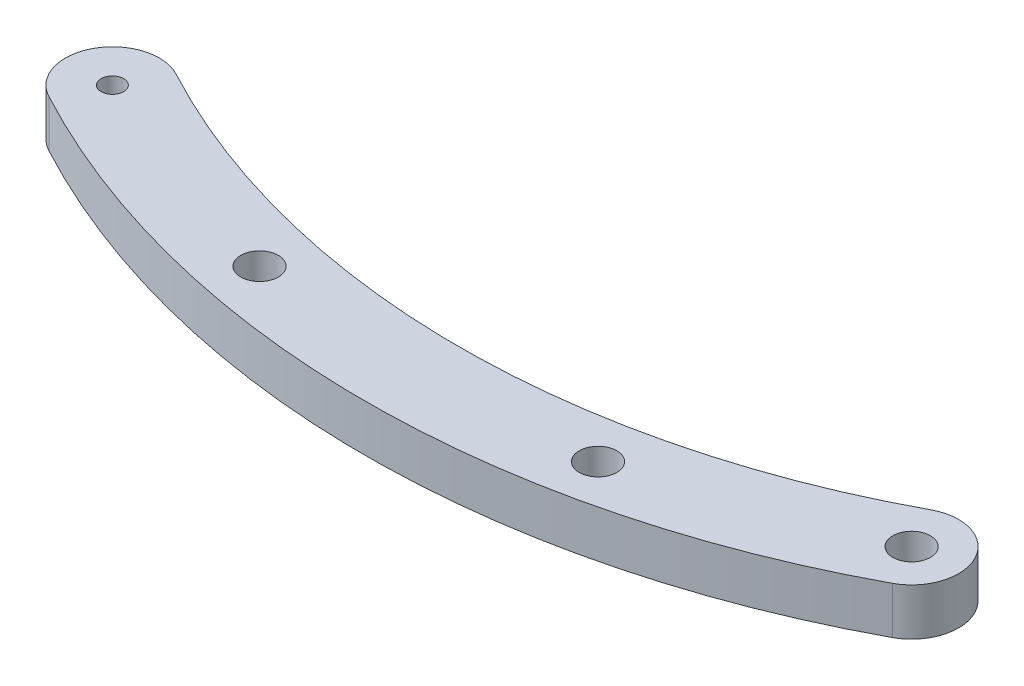
ISO-10303-21;
HEADER;
FILE_DESCRIPTION(('STEP AP214'),'2;1');
FILE_NAME('part.step','',(''),(''),'','','');
FILE_SCHEMA(('AUTOMOTIVE_DESIGN { 1 0 10303 214 1 1 1 1 }'));
ENDSEC;
DATA;
#1=APPLICATION_CONTEXT('core data for automotive mechanical design processes');
#2=APPLICATION_PROTOCOL_DEFINITION('international standard','automotive_design',2000,#1);
#3=PRODUCT_CONTEXT('',#1,'mechanical');
#4=PRODUCT('Part','Part','',(#3));
#5=PRODUCT_RELATED_PRODUCT_CATEGORY('part','',(#4));
#6=PRODUCT_DEFINITION_FORMATION('','',#4);
#7=PRODUCT_DEFINITION_CONTEXT('part definition',#1,'design');
#8=PRODUCT_DEFINITION('design','',#6,#7);
#9=PRODUCT_DEFINITION_SHAPE('','',#8);
#10=(LENGTH_UNIT() NAMED_UNIT(*) SI_UNIT(.MILLI.,.METRE.));
#11=(NAMED_UNIT(*) PLANE_ANGLE_UNIT() SI_UNIT($,.RADIAN.));
#12=(NAMED_UNIT(*) SI_UNIT($,.STERADIAN.) SOLID_ANGLE_UNIT());
#13=UNCERTAINTY_MEASURE_WITH_UNIT(LENGTH_MEASURE(1.E-05),#10,'distance_accuracy_value','');
#14=(GEOMETRIC_REPRESENTATION_CONTEXT(3) GLOBAL_UNCERTAINTY_ASSIGNED_CONTEXT((#13)) GLOBAL_UNIT_ASSIGNED_CONTEXT((#10,
#11,#12)) REPRESENTATION_CONTEXT('',''));
#15=CARTESIAN_POINT('',(0.,0.,0.));
#16=DIRECTION('',(0.,0.,1.));
#17=DIRECTION('',(1.,0.,0.));
#18=AXIS2_PLACEMENT_3D('',#15,#16,#17);
#19=CARTESIAN_POINT('',(0.,2.5,0.));
#20=DIRECTION('',(0.,-1.,0.));
#21=DIRECTION('',(0.,0.,1.));
#22=AXIS2_PLACEMENT_3D('',#19,#20,#21);
#23=CYLINDRICAL_SURFACE('',#22,2.50000000000001);
#24=CARTESIAN_POINT('',(0.,0.,0.));
#25=DIRECTION('',(0.,-1.,0.));
#26=DIRECTION('',(0.,0.,-1.));
#27=AXIS2_PLACEMENT_3D('',#24,#25,#26);
#28=CIRCLE('',#27,2.50000000000001);
#29=CARTESIAN_POINT('',(-1.18055555555556,0.,2.20369884064201));
#30=VERTEX_POINT('',#29);
#31=CARTESIAN_POINT('',(1.18055555555556,0.,-2.20369884064201));
#32=VERTEX_POINT('',#31);
#33=EDGE_CURVE('E116',#30,#32,#28,.T.);
#34=ORIENTED_EDGE('',*,*,#33,.F.);
#35=DIRECTION('',(0.,-1.,0.));
#36=VECTOR('',#35,1.);
#37=CARTESIAN_POINT('',(-1.18055555555556,2.5,2.20369884064201));
#38=LINE('',#37,#36);
#39=CARTESIAN_POINT('',(-1.18055555555556,2.5,2.20369884064201));
#40=VERTEX_POINT('',#39);
#41=EDGE_CURVE('E112',#40,#30,#38,.T.);
#42=ORIENTED_EDGE('',*,*,#41,.F.);
#43=CARTESIAN_POINT('',(0.,2.5,0.));
#44=DIRECTION('',(0.,-1.,0.));
#45=DIRECTION('',(0.,0.,-1.));
#46=AXIS2_PLACEMENT_3D('',#43,#44,#45);
#47=CIRCLE('',#46,2.50000000000001);
#48=CARTESIAN_POINT('',(1.18055555555556,2.5,-2.20369884064201));
#49=VERTEX_POINT('',#48);
#50=EDGE_CURVE('E102',#40,#49,#47,.T.);
#51=ORIENTED_EDGE('',*,*,#50,.T.);
#52=DIRECTION('',(0.,-1.,0.));
#53=VECTOR('',#52,1.);
#54=CARTESIAN_POINT('',(1.18055555555556,2.5,-2.20369884064201));
#55=LINE('',#54,#53);
#56=EDGE_CURVE('E11',#49,#32,#55,.T.);
#57=ORIENTED_EDGE('',*,*,#56,.T.);
#58=EDGE_LOOP('',(#34,#42,#51,#57));
#59=FACE_BOUND('',#58,.T.);
#60=ADVANCED_FACE('F43',(#59),#23,.T.);
#61=CARTESIAN_POINT('',(21.25,2.5,-39.6665791315561));
#62=DIRECTION('',(0.,-1.,0.));
#63=DIRECTION('',(0.,0.,1.));
#64=AXIS2_PLACEMENT_3D('',#61,#62,#63);
#65=CYLINDRICAL_SURFACE('',#64,42.5);
#66=CARTESIAN_POINT('',(21.25,0.,-39.6665791315561));
#67=DIRECTION('',(0.,-1.,0.));
#68=DIRECTION('',(0.,0.,-1.));
#69=AXIS2_PLACEMENT_3D('',#66,#67,#68);
#70=CIRCLE('',#69,42.5);
#71=CARTESIAN_POINT('',(41.3194444444444,0.,-2.20369884064201));
#72=VERTEX_POINT('',#71);
#73=EDGE_CURVE('E119',#32,#72,#70,.F.);
#74=ORIENTED_EDGE('',*,*,#73,.F.);
#75=ORIENTED_EDGE('',*,*,#56,.F.);
#76=CARTESIAN_POINT('',(21.25,2.5,-39.6665791315561));
#77=DIRECTION('',(0.,-1.,0.));
#78=DIRECTION('',(0.,0.,-1.));
#79=AXIS2_PLACEMENT_3D('',#76,#77,#78);
#80=CIRCLE('',#79,42.5);
#81=CARTESIAN_POINT('',(41.3194444444444,2.5,-2.20369884064201));
#82=VERTEX_POINT('',#81);
#83=EDGE_CURVE('E85',#49,#82,#80,.F.);
#84=ORIENTED_EDGE('',*,*,#83,.T.);
#85=DIRECTION('',(0.,-1.,0.));
#86=VECTOR('',#85,1.);
#87=CARTESIAN_POINT('',(41.3194444444444,2.5,-2.20369884064201));
#88=LINE('',#87,#86);
#89=EDGE_CURVE('E52',#82,#72,#88,.T.);
#90=ORIENTED_EDGE('',*,*,#89,.T.);
#91=EDGE_LOOP('',(#74,#75,#84,#90));
#92=FACE_BOUND('',#91,.T.);
#93=ADVANCED_FACE('F100',(#92),#65,.F.);
#94=CARTESIAN_POINT('',(42.5,2.5,0.));
#95=DIRECTION('',(0.,-1.,0.));
#96=DIRECTION('',(0.,0.,1.));
#97=AXIS2_PLACEMENT_3D('',#94,#95,#96);
#98=CYLINDRICAL_SURFACE('',#97,2.50000000000001);
#99=CARTESIAN_POINT('',(42.5,0.,0.));
#100=DIRECTION('',(0.,-1.,0.));
#101=DIRECTION('',(0.,0.,-1.));
#102=AXIS2_PLACEMENT_3D('',#99,#100,#101);
#103=CIRCLE('',#102,2.50000000000001);
#104=CARTESIAN_POINT('',(43.6805555555556,0.,2.20369884064201));
#105=VERTEX_POINT('',#104);
#106=EDGE_CURVE('E96',#72,#105,#103,.T.);
#107=ORIENTED_EDGE('',*,*,#106,.F.);
#108=ORIENTED_EDGE('',*,*,#89,.F.);
#109=CARTESIAN_POINT('',(42.5,2.5,0.));
#110=DIRECTION('',(0.,-1.,0.));
#111=DIRECTION('',(0.,0.,-1.));
#112=AXIS2_PLACEMENT_3D('',#109,#110,#111);
#113=CIRCLE('',#112,2.50000000000001);
#114=CARTESIAN_POINT('',(43.6805555555556,2.5,2.20369884064201));
#115=VERTEX_POINT('',#114);
#116=EDGE_CURVE('E88',#82,#115,#113,.T.);
#117=ORIENTED_EDGE('',*,*,#116,.T.);
#118=DIRECTION('',(0.,-1.,0.));
#119=VECTOR('',#118,1.);
#120=CARTESIAN_POINT('',(43.6805555555556,2.5,2.20369884064201));
#121=LINE('',#120,#119);
#122=EDGE_CURVE('E99',#115,#105,#121,.T.);
#123=ORIENTED_EDGE('',*,*,#122,.T.);
#124=EDGE_LOOP('',(#107,#108,#117,#123));
#125=FACE_BOUND('',#124,.T.);
#126=ADVANCED_FACE('F95',(#125),#98,.T.);
#127=CARTESIAN_POINT('',(21.25,2.5,-39.6665791315561));
#128=DIRECTION('',(0.,-1.,0.));
#129=DIRECTION('',(0.,0.,1.));
#130=AXIS2_PLACEMENT_3D('',#127,#128,#129);
#131=CYLINDRICAL_SURFACE('',#130,47.5);
#132=CARTESIAN_POINT('',(21.25,0.,-39.6665791315561));
#133=DIRECTION('',(0.,-1.,0.));
#134=DIRECTION('',(0.,0.,-1.));
#135=AXIS2_PLACEMENT_3D('',#132,#133,#134);
#136=CIRCLE('',#135,47.5);
#137=EDGE_CURVE('E74',#30,#105,#136,.F.);
#138=ORIENTED_EDGE('',*,*,#137,.T.);
#139=ORIENTED_EDGE('',*,*,#122,.F.);
#140=CARTESIAN_POINT('',(21.25,2.5,-39.6665791315561));
#141=DIRECTION('',(0.,-1.,0.));
#142=DIRECTION('',(0.,0.,-1.));
#143=AXIS2_PLACEMENT_3D('',#140,#141,#142);
#144=CIRCLE('',#143,47.5);
#145=EDGE_CURVE('E60',#40,#115,#144,.F.);
#146=ORIENTED_EDGE('',*,*,#145,.F.);
#147=ORIENTED_EDGE('',*,*,#41,.T.);
#148=EDGE_LOOP('',(#138,#139,#146,#147));
#149=FACE_BOUND('',#148,.T.);
#150=ADVANCED_FACE('F132',(#149),#131,.T.);
#151=CARTESIAN_POINT('',(0.,2.5,0.));
#152=DIRECTION('',(0.,-1.,0.));
#153=DIRECTION('',(0.,0.,1.));
#154=AXIS2_PLACEMENT_3D('',#151,#152,#153);
#155=CYLINDRICAL_SURFACE('',#154,0.6);
#156=CARTESIAN_POINT('',(0.,2.5,0.));
#157=DIRECTION('',(0.,-1.,0.));
#158=DIRECTION('',(0.,0.,-1.));
#159=AXIS2_PLACEMENT_3D('',#156,#157,#158);
#160=CIRCLE('',#159,0.6);
#161=CARTESIAN_POINT('',(0.,2.5,-0.6));
#162=VERTEX_POINT('',#161);
#163=EDGE_CURVE('E104',#162,#162,#160,.T.);
#164=ORIENTED_EDGE('',*,*,#163,.F.);
#165=EDGE_LOOP('',(#164));
#166=FACE_BOUND('',#165,.T.);
#167=CARTESIAN_POINT('',(0.,0.,0.));
#168=DIRECTION('',(0.,-1.,0.));
#169=DIRECTION('',(0.,0.,-1.));
#170=AXIS2_PLACEMENT_3D('',#167,#168,#169);
#171=CIRCLE('',#170,0.6);
#172=CARTESIAN_POINT('',(0.,0.,-0.6));
#173=VERTEX_POINT('',#172);
#174=EDGE_CURVE('E113',#173,#173,#171,.T.);
#175=ORIENTED_EDGE('',*,*,#174,.T.);
#176=EDGE_LOOP('',(#175));
#177=FACE_BOUND('',#176,.T.);
#178=ADVANCED_FACE('F45',(#166,#177),#155,.F.);
#179=CARTESIAN_POINT('',(42.5,2.5,0.));
#180=DIRECTION('',(0.,-1.,0.));
#181=DIRECTION('',(0.,0.,1.));
#182=AXIS2_PLACEMENT_3D('',#179,#180,#181);
#183=CYLINDRICAL_SURFACE('',#182,0.999999999999998);
#184=CARTESIAN_POINT('',(42.5,2.5,0.));
#185=DIRECTION('',(0.,-1.,0.));
#186=DIRECTION('',(0.,0.,-1.));
#187=AXIS2_PLACEMENT_3D('',#184,#185,#186);
#188=CIRCLE('',#187,0.999999999999998);
#189=CARTESIAN_POINT('',(42.5,2.5,-0.999999999999998));
#190=VERTEX_POINT('',#189);
#191=EDGE_CURVE('E109',#190,#190,#188,.T.);
#192=ORIENTED_EDGE('',*,*,#191,.F.);
#193=EDGE_LOOP('',(#192));
#194=FACE_BOUND('',#193,.T.);
#195=CARTESIAN_POINT('',(42.5,0.,0.));
#196=DIRECTION('',(0.,-1.,0.));
#197=DIRECTION('',(0.,0.,-1.));
#198=AXIS2_PLACEMENT_3D('',#195,#196,#197);
#199=CIRCLE('',#198,0.999999999999998);
#200=CARTESIAN_POINT('',(42.5,0.,-0.999999999999998));
#201=VERTEX_POINT('',#200);
#202=EDGE_CURVE('E123',#201,#201,#199,.T.);
#203=ORIENTED_EDGE('',*,*,#202,.T.);
#204=EDGE_LOOP('',(#203));
#205=FACE_BOUND('',#204,.T.);
#206=ADVANCED_FACE('F139',(#194,#205),#183,.F.);
#207=CARTESIAN_POINT('',(0.,2.5,0.));
#208=DIRECTION('',(0.,1.,0.));
#209=DIRECTION('',(0.,0.,-1.));
#210=AXIS2_PLACEMENT_3D('',#207,#208,#209);
#211=PLANE('',#210);
#212=CARTESIAN_POINT('',(12.25,2.5,4.42423623854113));
#213=DIRECTION('',(0.,-1.,0.));
#214=DIRECTION('',(0.,0.,-1.));
#215=AXIS2_PLACEMENT_3D('',#212,#213,#214);
#216=CIRCLE('',#215,1.);
#217=CARTESIAN_POINT('',(12.25,2.5,3.42423623854112));
#218=VERTEX_POINT('',#217);
#219=EDGE_CURVE('E233',#218,#218,#216,.T.);
#220=ORIENTED_EDGE('',*,*,#219,.T.);
#221=EDGE_LOOP('',(#220));
#222=FACE_BOUND('',#221,.T.);
#223=CARTESIAN_POINT('',(30.25,2.5,4.42423623854113));
#224=DIRECTION('',(0.,-1.,0.));
#225=DIRECTION('',(0.,0.,-1.));
#226=AXIS2_PLACEMENT_3D('',#223,#224,#225);
#227=CIRCLE('',#226,0.999999999999998);
#228=CARTESIAN_POINT('',(30.25,2.5,3.42423623854113));
#229=VERTEX_POINT('',#228);
#230=EDGE_CURVE('E234',#229,#229,#227,.T.);
#231=ORIENTED_EDGE('',*,*,#230,.T.);
#232=EDGE_LOOP('',(#231));
#233=FACE_BOUND('',#232,.T.);
#234=ORIENTED_EDGE('',*,*,#163,.T.);
#235=EDGE_LOOP('',(#234));
#236=FACE_BOUND('',#235,.T.);
#237=ORIENTED_EDGE('',*,*,#50,.F.);
#238=ORIENTED_EDGE('',*,*,#145,.T.);
#239=ORIENTED_EDGE('',*,*,#116,.F.);
#240=ORIENTED_EDGE('',*,*,#83,.F.);
#241=EDGE_LOOP('',(#237,#238,#239,#240));
#242=FACE_BOUND('',#241,.T.);
#243=ORIENTED_EDGE('',*,*,#191,.T.);
#244=EDGE_LOOP('',(#243));
#245=FACE_BOUND('',#244,.T.);
#246=ADVANCED_FACE('F90',(#222,#233,#236,#242,#245),#211,.T.);
#247=CARTESIAN_POINT('',(0.,0.,0.));
#248=DIRECTION('',(0.,1.,0.));
#249=DIRECTION('',(0.,0.,-1.));
#250=AXIS2_PLACEMENT_3D('',#247,#248,#249);
#251=PLANE('',#250);
#252=CARTESIAN_POINT('',(12.25,0.,4.42423623854113));
#253=DIRECTION('',(0.,-1.,0.));
#254=DIRECTION('',(0.,0.,-1.));
#255=AXIS2_PLACEMENT_3D('',#252,#253,#254);
#256=CIRCLE('',#255,1.);
#257=CARTESIAN_POINT('',(12.25,0.,3.42423623854112));
#258=VERTEX_POINT('',#257);
#259=EDGE_CURVE('E117',#258,#258,#256,.T.);
#260=ORIENTED_EDGE('',*,*,#259,.F.);
#261=EDGE_LOOP('',(#260));
#262=FACE_BOUND('',#261,.T.);
#263=CARTESIAN_POINT('',(30.25,0.,4.42423623854113));
#264=DIRECTION('',(0.,-1.,0.));
#265=DIRECTION('',(0.,0.,-1.));
#266=AXIS2_PLACEMENT_3D('',#263,#264,#265);
#267=CIRCLE('',#266,0.999999999999998);
#268=CARTESIAN_POINT('',(30.25,0.,3.42423623854113));
#269=VERTEX_POINT('',#268);
#270=EDGE_CURVE('E238',#269,#269,#267,.T.);
#271=ORIENTED_EDGE('',*,*,#270,.F.);
#272=EDGE_LOOP('',(#271));
#273=FACE_BOUND('',#272,.T.);
#274=ORIENTED_EDGE('',*,*,#174,.F.);
#275=EDGE_LOOP('',(#274));
#276=FACE_BOUND('',#275,.T.);
#277=ORIENTED_EDGE('',*,*,#33,.T.);
#278=ORIENTED_EDGE('',*,*,#73,.T.);
#279=ORIENTED_EDGE('',*,*,#106,.T.);
#280=ORIENTED_EDGE('',*,*,#137,.F.);
#281=EDGE_LOOP('',(#277,#278,#279,#280));
#282=FACE_BOUND('',#281,.T.);
#283=ORIENTED_EDGE('',*,*,#202,.F.);
#284=EDGE_LOOP('',(#283));
#285=FACE_BOUND('',#284,.T.);
#286=ADVANCED_FACE('F127',(#262,#273,#276,#282,#285),#251,.F.);
#287=CARTESIAN_POINT('',(30.25,0.,4.42423623854113));
#288=DIRECTION('',(0.,1.,0.));
#289=DIRECTION('',(0.,0.,-1.));
#290=AXIS2_PLACEMENT_3D('',#287,#288,#289);
#291=CYLINDRICAL_SURFACE('',#290,0.999999999999998);
#292=ORIENTED_EDGE('',*,*,#270,.T.);
#293=EDGE_LOOP('',(#292));
#294=FACE_BOUND('',#293,.T.);
#295=ORIENTED_EDGE('',*,*,#230,.F.);
#296=EDGE_LOOP('',(#295));
#297=FACE_BOUND('',#296,.T.);
#298=ADVANCED_FACE('F200',(#294,#297),#291,.F.);
#299=CARTESIAN_POINT('',(12.25,0.,4.42423623854113));
#300=DIRECTION('',(0.,1.,0.));
#301=DIRECTION('',(0.,0.,-1.));
#302=AXIS2_PLACEMENT_3D('',#299,#300,#301);
#303=CYLINDRICAL_SURFACE('',#302,1.);
#304=ORIENTED_EDGE('',*,*,#259,.T.);
#305=EDGE_LOOP('',(#304));
#306=FACE_BOUND('',#305,.T.);
#307=ORIENTED_EDGE('',*,*,#219,.F.);
#308=EDGE_LOOP('',(#307));
#309=FACE_BOUND('',#308,.T.);
#310=ADVANCED_FACE('F216',(#306,#309),#303,.F.);
#311=CLOSED_SHELL('',(#60,#93,#126,#150,#178,#206,#246,#286,#298,#310));
#312=MANIFOLD_SOLID_BREP('B2',#311);
#313=ADVANCED_BREP_SHAPE_REPRESENTATION('',(#18,#312),#14);
#314=SHAPE_DEFINITION_REPRESENTATION(#9,#313);
ENDSEC;
END-ISO-10303-21;
